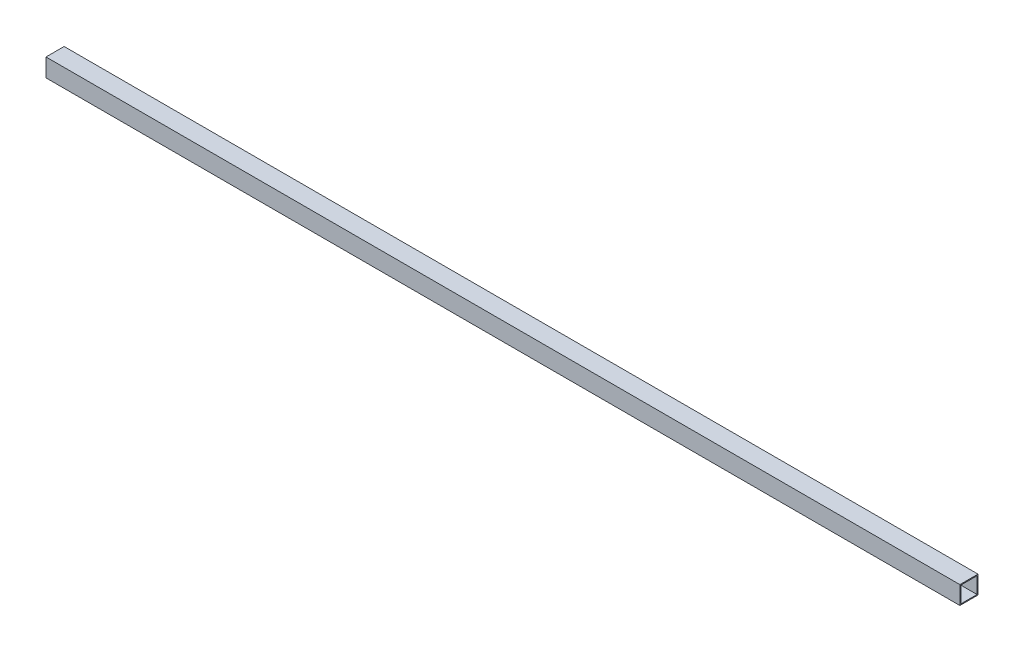
ISO-10303-21;
HEADER;
FILE_DESCRIPTION(('STEP AP214'),'2;1');
FILE_NAME('part.step','',(''),(''),'','','');
FILE_SCHEMA(('AUTOMOTIVE_DESIGN { 1 0 10303 214 1 1 1 1 }'));
ENDSEC;
DATA;
#1=APPLICATION_CONTEXT('core data for automotive mechanical design processes');
#2=APPLICATION_PROTOCOL_DEFINITION('international standard','automotive_design',2000,#1);
#3=PRODUCT_CONTEXT('',#1,'mechanical');
#4=PRODUCT('Part','Part','',(#3));
#5=PRODUCT_RELATED_PRODUCT_CATEGORY('part','',(#4));
#6=PRODUCT_DEFINITION_FORMATION('','',#4);
#7=PRODUCT_DEFINITION_CONTEXT('part definition',#1,'design');
#8=PRODUCT_DEFINITION('design','',#6,#7);
#9=PRODUCT_DEFINITION_SHAPE('','',#8);
#10=(LENGTH_UNIT() NAMED_UNIT(*) SI_UNIT(.MILLI.,.METRE.));
#11=(NAMED_UNIT(*) PLANE_ANGLE_UNIT() SI_UNIT($,.RADIAN.));
#12=(NAMED_UNIT(*) SI_UNIT($,.STERADIAN.) SOLID_ANGLE_UNIT());
#13=UNCERTAINTY_MEASURE_WITH_UNIT(LENGTH_MEASURE(1.E-05),#10,'distance_accuracy_value','');
#14=(GEOMETRIC_REPRESENTATION_CONTEXT(3) GLOBAL_UNCERTAINTY_ASSIGNED_CONTEXT((#13)) GLOBAL_UNIT_ASSIGNED_CONTEXT((#10,
#11,#12)) REPRESENTATION_CONTEXT('',''));
#15=CARTESIAN_POINT('',(0.,0.,0.));
#16=DIRECTION('',(0.,0.,1.));
#17=DIRECTION('',(1.,0.,0.));
#18=AXIS2_PLACEMENT_3D('',#15,#16,#17);
#19=CARTESIAN_POINT('',(960.,0.,0.));
#20=DIRECTION('',(1.,0.,0.));
#21=DIRECTION('',(0.,0.,-1.));
#22=AXIS2_PLACEMENT_3D('',#19,#20,#21);
#23=PLANE('',#22);
#24=DIRECTION('',(0.,1.,0.));
#25=VECTOR('',#24,1.);
#26=CARTESIAN_POINT('',(960.,9.525,-9.525));
#27=LINE('',#26,#25);
#28=CARTESIAN_POINT('',(960.,-9.525,-9.525));
#29=VERTEX_POINT('',#28);
#30=CARTESIAN_POINT('',(960.,9.525,-9.525));
#31=VERTEX_POINT('',#30);
#32=EDGE_CURVE('E134',#29,#31,#27,.T.);
#33=ORIENTED_EDGE('',*,*,#32,.T.);
#34=DIRECTION('',(0.,0.,1.));
#35=VECTOR('',#34,1.);
#36=CARTESIAN_POINT('',(960.,9.525,9.525));
#37=LINE('',#36,#35);
#38=CARTESIAN_POINT('',(960.,9.525,9.525));
#39=VERTEX_POINT('',#38);
#40=EDGE_CURVE('E137',#31,#39,#37,.T.);
#41=ORIENTED_EDGE('',*,*,#40,.T.);
#42=DIRECTION('',(0.,-1.,0.));
#43=VECTOR('',#42,1.);
#44=CARTESIAN_POINT('',(960.,9.525,9.525));
#45=LINE('',#44,#43);
#46=CARTESIAN_POINT('',(960.,-9.525,9.525));
#47=VERTEX_POINT('',#46);
#48=EDGE_CURVE('E140',#39,#47,#45,.T.);
#49=ORIENTED_EDGE('',*,*,#48,.T.);
#50=DIRECTION('',(0.,0.,-1.));
#51=VECTOR('',#50,1.);
#52=CARTESIAN_POINT('',(960.,-9.525,9.525));
#53=LINE('',#52,#51);
#54=EDGE_CURVE('E142',#47,#29,#53,.T.);
#55=ORIENTED_EDGE('',*,*,#54,.T.);
#56=EDGE_LOOP('',(#33,#41,#49,#55));
#57=FACE_BOUND('',#56,.T.);
#58=DIRECTION('',(0.,0.,-1.));
#59=VECTOR('',#58,1.);
#60=CARTESIAN_POINT('',(960.,-8.525,8.525));
#61=LINE('',#60,#59);
#62=CARTESIAN_POINT('',(960.,-8.525,8.525));
#63=VERTEX_POINT('',#62);
#64=CARTESIAN_POINT('',(960.,-8.525,-8.525));
#65=VERTEX_POINT('',#64);
#66=EDGE_CURVE('E106',#63,#65,#61,.T.);
#67=ORIENTED_EDGE('',*,*,#66,.F.);
#68=DIRECTION('',(0.,-1.,0.));
#69=VECTOR('',#68,1.);
#70=CARTESIAN_POINT('',(960.,8.525,8.525));
#71=LINE('',#70,#69);
#72=CARTESIAN_POINT('',(960.,8.525,8.525));
#73=VERTEX_POINT('',#72);
#74=EDGE_CURVE('E98',#73,#63,#71,.T.);
#75=ORIENTED_EDGE('',*,*,#74,.F.);
#76=DIRECTION('',(0.,0.,1.));
#77=VECTOR('',#76,1.);
#78=CARTESIAN_POINT('',(960.,8.525,8.525));
#79=LINE('',#78,#77);
#80=CARTESIAN_POINT('',(960.,8.525,-8.525));
#81=VERTEX_POINT('',#80);
#82=EDGE_CURVE('E120',#81,#73,#79,.T.);
#83=ORIENTED_EDGE('',*,*,#82,.F.);
#84=DIRECTION('',(0.,1.,0.));
#85=VECTOR('',#84,1.);
#86=CARTESIAN_POINT('',(960.,8.525,-8.525));
#87=LINE('',#86,#85);
#88=EDGE_CURVE('E118',#65,#81,#87,.T.);
#89=ORIENTED_EDGE('',*,*,#88,.F.);
#90=EDGE_LOOP('',(#67,#75,#83,#89));
#91=FACE_BOUND('',#90,.T.);
#92=ADVANCED_FACE('F33',(#57,#91),#23,.T.);
#93=CARTESIAN_POINT('',(0.,0.,0.));
#94=DIRECTION('',(1.,0.,0.));
#95=DIRECTION('',(0.,0.,-1.));
#96=AXIS2_PLACEMENT_3D('',#93,#94,#95);
#97=PLANE('',#96);
#98=DIRECTION('',(0.,1.,0.));
#99=VECTOR('',#98,1.);
#100=CARTESIAN_POINT('',(0.,9.525,-9.525));
#101=LINE('',#100,#99);
#102=CARTESIAN_POINT('',(0.,-9.525,-9.525));
#103=VERTEX_POINT('',#102);
#104=CARTESIAN_POINT('',(0.,9.525,-9.525));
#105=VERTEX_POINT('',#104);
#106=EDGE_CURVE('E114',#103,#105,#101,.T.);
#107=ORIENTED_EDGE('',*,*,#106,.F.);
#108=DIRECTION('',(0.,0.,-1.));
#109=VECTOR('',#108,1.);
#110=CARTESIAN_POINT('',(0.,-9.525,9.525));
#111=LINE('',#110,#109);
#112=CARTESIAN_POINT('',(0.,-9.525,9.525));
#113=VERTEX_POINT('',#112);
#114=EDGE_CURVE('E138',#113,#103,#111,.T.);
#115=ORIENTED_EDGE('',*,*,#114,.F.);
#116=DIRECTION('',(0.,-1.,0.));
#117=VECTOR('',#116,1.);
#118=CARTESIAN_POINT('',(0.,9.525,9.525));
#119=LINE('',#118,#117);
#120=CARTESIAN_POINT('',(0.,9.525,9.525));
#121=VERTEX_POINT('',#120);
#122=EDGE_CURVE('E149',#121,#113,#119,.T.);
#123=ORIENTED_EDGE('',*,*,#122,.F.);
#124=DIRECTION('',(0.,0.,1.));
#125=VECTOR('',#124,1.);
#126=CARTESIAN_POINT('',(0.,9.525,9.525));
#127=LINE('',#126,#125);
#128=EDGE_CURVE('E147',#105,#121,#127,.T.);
#129=ORIENTED_EDGE('',*,*,#128,.F.);
#130=EDGE_LOOP('',(#107,#115,#123,#129));
#131=FACE_BOUND('',#130,.T.);
#132=DIRECTION('',(0.,-1.,0.));
#133=VECTOR('',#132,1.);
#134=CARTESIAN_POINT('',(0.,8.525,8.525));
#135=LINE('',#134,#133);
#136=CARTESIAN_POINT('',(0.,8.525,8.525));
#137=VERTEX_POINT('',#136);
#138=CARTESIAN_POINT('',(0.,-8.525,8.525));
#139=VERTEX_POINT('',#138);
#140=EDGE_CURVE('E56',#137,#139,#135,.T.);
#141=ORIENTED_EDGE('',*,*,#140,.T.);
#142=DIRECTION('',(0.,0.,-1.));
#143=VECTOR('',#142,1.);
#144=CARTESIAN_POINT('',(0.,-8.525,8.525));
#145=LINE('',#144,#143);
#146=CARTESIAN_POINT('',(0.,-8.525,-8.525));
#147=VERTEX_POINT('',#146);
#148=EDGE_CURVE('E113',#139,#147,#145,.T.);
#149=ORIENTED_EDGE('',*,*,#148,.T.);
#150=DIRECTION('',(0.,1.,0.));
#151=VECTOR('',#150,1.);
#152=CARTESIAN_POINT('',(0.,8.525,-8.525));
#153=LINE('',#152,#151);
#154=CARTESIAN_POINT('',(0.,8.525,-8.525));
#155=VERTEX_POINT('',#154);
#156=EDGE_CURVE('E126',#147,#155,#153,.T.);
#157=ORIENTED_EDGE('',*,*,#156,.T.);
#158=DIRECTION('',(0.,0.,1.));
#159=VECTOR('',#158,1.);
#160=CARTESIAN_POINT('',(0.,8.525,8.525));
#161=LINE('',#160,#159);
#162=EDGE_CURVE('E107',#155,#137,#161,.T.);
#163=ORIENTED_EDGE('',*,*,#162,.T.);
#164=EDGE_LOOP('',(#141,#149,#157,#163));
#165=FACE_BOUND('',#164,.T.);
#166=ADVANCED_FACE('F167',(#131,#165),#97,.F.);
#167=CARTESIAN_POINT('',(960.,9.525,-9.525));
#168=DIRECTION('',(0.,0.,1.));
#169=DIRECTION('',(0.,-1.,0.));
#170=AXIS2_PLACEMENT_3D('',#167,#168,#169);
#171=PLANE('',#170);
#172=ORIENTED_EDGE('',*,*,#106,.T.);
#173=DIRECTION('',(-1.,0.,0.));
#174=VECTOR('',#173,1.);
#175=CARTESIAN_POINT('',(960.,9.525,-9.525));
#176=LINE('',#175,#174);
#177=EDGE_CURVE('E11',#31,#105,#176,.T.);
#178=ORIENTED_EDGE('',*,*,#177,.F.);
#179=ORIENTED_EDGE('',*,*,#32,.F.);
#180=DIRECTION('',(-1.,0.,0.));
#181=VECTOR('',#180,1.);
#182=CARTESIAN_POINT('',(960.,-9.525,-9.525));
#183=LINE('',#182,#181);
#184=EDGE_CURVE('E144',#29,#103,#183,.T.);
#185=ORIENTED_EDGE('',*,*,#184,.T.);
#186=EDGE_LOOP('',(#172,#178,#179,#185));
#187=FACE_BOUND('',#186,.T.);
#188=ADVANCED_FACE('F35',(#187),#171,.F.);
#189=CARTESIAN_POINT('',(960.,9.525,9.525));
#190=DIRECTION('',(0.,-1.,0.));
#191=DIRECTION('',(0.,0.,-1.));
#192=AXIS2_PLACEMENT_3D('',#189,#190,#191);
#193=PLANE('',#192);
#194=ORIENTED_EDGE('',*,*,#128,.T.);
#195=DIRECTION('',(-1.,0.,0.));
#196=VECTOR('',#195,1.);
#197=CARTESIAN_POINT('',(960.,9.525,9.525));
#198=LINE('',#197,#196);
#199=EDGE_CURVE('E41',#39,#121,#198,.T.);
#200=ORIENTED_EDGE('',*,*,#199,.F.);
#201=ORIENTED_EDGE('',*,*,#40,.F.);
#202=ORIENTED_EDGE('',*,*,#177,.T.);
#203=EDGE_LOOP('',(#194,#200,#201,#202));
#204=FACE_BOUND('',#203,.T.);
#205=ADVANCED_FACE('F177',(#204),#193,.F.);
#206=CARTESIAN_POINT('',(960.,9.525,9.525));
#207=DIRECTION('',(0.,0.,-1.));
#208=DIRECTION('',(0.,1.,0.));
#209=AXIS2_PLACEMENT_3D('',#206,#207,#208);
#210=PLANE('',#209);
#211=ORIENTED_EDGE('',*,*,#122,.T.);
#212=DIRECTION('',(-1.,0.,0.));
#213=VECTOR('',#212,1.);
#214=CARTESIAN_POINT('',(960.,-9.525,9.525));
#215=LINE('',#214,#213);
#216=EDGE_CURVE('E154',#47,#113,#215,.T.);
#217=ORIENTED_EDGE('',*,*,#216,.F.);
#218=ORIENTED_EDGE('',*,*,#48,.F.);
#219=ORIENTED_EDGE('',*,*,#199,.T.);
#220=EDGE_LOOP('',(#211,#217,#218,#219));
#221=FACE_BOUND('',#220,.T.);
#222=ADVANCED_FACE('F161',(#221),#210,.F.);
#223=CARTESIAN_POINT('',(960.,-9.525,9.525));
#224=DIRECTION('',(0.,1.,0.));
#225=DIRECTION('',(0.,0.,1.));
#226=AXIS2_PLACEMENT_3D('',#223,#224,#225);
#227=PLANE('',#226);
#228=ORIENTED_EDGE('',*,*,#114,.T.);
#229=ORIENTED_EDGE('',*,*,#184,.F.);
#230=ORIENTED_EDGE('',*,*,#54,.F.);
#231=ORIENTED_EDGE('',*,*,#216,.T.);
#232=EDGE_LOOP('',(#228,#229,#230,#231));
#233=FACE_BOUND('',#232,.T.);
#234=ADVANCED_FACE('F171',(#233),#227,.F.);
#235=CARTESIAN_POINT('',(960.,8.525,8.525));
#236=DIRECTION('',(0.,0.,-1.));
#237=DIRECTION('',(-1.,0.,0.));
#238=AXIS2_PLACEMENT_3D('',#235,#236,#237);
#239=PLANE('',#238);
#240=ORIENTED_EDGE('',*,*,#140,.F.);
#241=DIRECTION('',(-1.,0.,0.));
#242=VECTOR('',#241,1.);
#243=CARTESIAN_POINT('',(960.,8.525,8.525));
#244=LINE('',#243,#242);
#245=EDGE_CURVE('E102',#73,#137,#244,.T.);
#246=ORIENTED_EDGE('',*,*,#245,.F.);
#247=ORIENTED_EDGE('',*,*,#74,.T.);
#248=DIRECTION('',(-1.,0.,0.));
#249=VECTOR('',#248,1.);
#250=CARTESIAN_POINT('',(960.,-8.525,8.525));
#251=LINE('',#250,#249);
#252=EDGE_CURVE('E101',#63,#139,#251,.T.);
#253=ORIENTED_EDGE('',*,*,#252,.T.);
#254=EDGE_LOOP('',(#240,#246,#247,#253));
#255=FACE_BOUND('',#254,.T.);
#256=ADVANCED_FACE('F100',(#255),#239,.T.);
#257=CARTESIAN_POINT('',(960.,-8.525,8.525));
#258=DIRECTION('',(0.,1.,0.));
#259=DIRECTION('',(0.,0.,1.));
#260=AXIS2_PLACEMENT_3D('',#257,#258,#259);
#261=PLANE('',#260);
#262=ORIENTED_EDGE('',*,*,#148,.F.);
#263=ORIENTED_EDGE('',*,*,#252,.F.);
#264=ORIENTED_EDGE('',*,*,#66,.T.);
#265=DIRECTION('',(-1.,0.,0.));
#266=VECTOR('',#265,1.);
#267=CARTESIAN_POINT('',(960.,-8.525,-8.525));
#268=LINE('',#267,#266);
#269=EDGE_CURVE('E115',#65,#147,#268,.T.);
#270=ORIENTED_EDGE('',*,*,#269,.T.);
#271=EDGE_LOOP('',(#262,#263,#264,#270));
#272=FACE_BOUND('',#271,.T.);
#273=ADVANCED_FACE('F110',(#272),#261,.T.);
#274=CARTESIAN_POINT('',(960.,8.525,-8.525));
#275=DIRECTION('',(0.,0.,1.));
#276=DIRECTION('',(0.,-1.,0.));
#277=AXIS2_PLACEMENT_3D('',#274,#275,#276);
#278=PLANE('',#277);
#279=ORIENTED_EDGE('',*,*,#156,.F.);
#280=ORIENTED_EDGE('',*,*,#269,.F.);
#281=ORIENTED_EDGE('',*,*,#88,.T.);
#282=DIRECTION('',(-1.,0.,0.));
#283=VECTOR('',#282,1.);
#284=CARTESIAN_POINT('',(960.,8.525,-8.525));
#285=LINE('',#284,#283);
#286=EDGE_CURVE('E48',#81,#155,#285,.T.);
#287=ORIENTED_EDGE('',*,*,#286,.T.);
#288=EDGE_LOOP('',(#279,#280,#281,#287));
#289=FACE_BOUND('',#288,.T.);
#290=ADVANCED_FACE('F200',(#289),#278,.T.);
#291=CARTESIAN_POINT('',(960.,8.525,8.525));
#292=DIRECTION('',(0.,-1.,0.));
#293=DIRECTION('',(0.,0.,-1.));
#294=AXIS2_PLACEMENT_3D('',#291,#292,#293);
#295=PLANE('',#294);
#296=ORIENTED_EDGE('',*,*,#162,.F.);
#297=ORIENTED_EDGE('',*,*,#286,.F.);
#298=ORIENTED_EDGE('',*,*,#82,.T.);
#299=ORIENTED_EDGE('',*,*,#245,.T.);
#300=EDGE_LOOP('',(#296,#297,#298,#299));
#301=FACE_BOUND('',#300,.T.);
#302=ADVANCED_FACE('F204',(#301),#295,.T.);
#303=CLOSED_SHELL('',(#92,#166,#188,#205,#222,#234,#256,#273,#290,#302));
#304=MANIFOLD_SOLID_BREP('B2',#303);
#305=ADVANCED_BREP_SHAPE_REPRESENTATION('',(#18,#304),#14);
#306=SHAPE_DEFINITION_REPRESENTATION(#9,#305);
ENDSEC;
END-ISO-10303-21;
